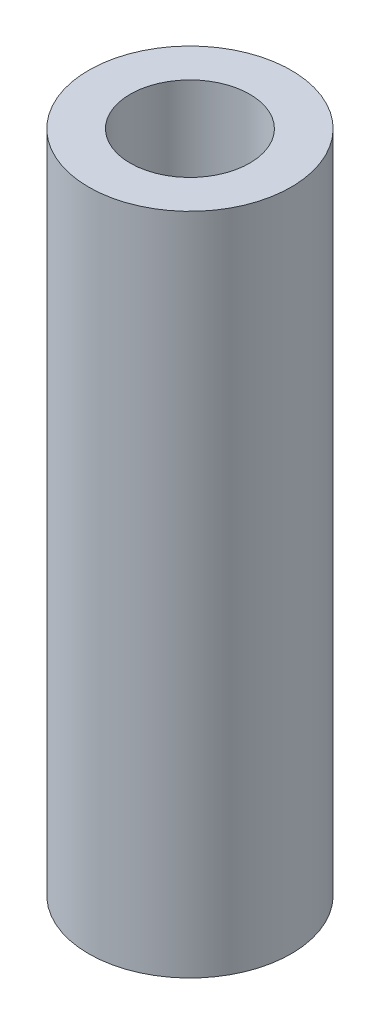
ISO-10303-21;
HEADER;
FILE_DESCRIPTION(('STEP AP214'),'2;1');
FILE_NAME('part.step','',(''),(''),'','','');
FILE_SCHEMA(('AUTOMOTIVE_DESIGN { 1 0 10303 214 1 1 1 1 }'));
ENDSEC;
DATA;
#1=APPLICATION_CONTEXT('core data for automotive mechanical design processes');
#2=APPLICATION_PROTOCOL_DEFINITION('international standard','automotive_design',2000,#1);
#3=PRODUCT_CONTEXT('',#1,'mechanical');
#4=PRODUCT('Part','Part','',(#3));
#5=PRODUCT_RELATED_PRODUCT_CATEGORY('part','',(#4));
#6=PRODUCT_DEFINITION_FORMATION('','',#4);
#7=PRODUCT_DEFINITION_CONTEXT('part definition',#1,'design');
#8=PRODUCT_DEFINITION('design','',#6,#7);
#9=PRODUCT_DEFINITION_SHAPE('','',#8);
#10=(LENGTH_UNIT() NAMED_UNIT(*) SI_UNIT(.MILLI.,.METRE.));
#11=(NAMED_UNIT(*) PLANE_ANGLE_UNIT() SI_UNIT($,.RADIAN.));
#12=(NAMED_UNIT(*) SI_UNIT($,.STERADIAN.) SOLID_ANGLE_UNIT());
#13=UNCERTAINTY_MEASURE_WITH_UNIT(LENGTH_MEASURE(1.E-05),#10,'distance_accuracy_value','');
#14=(GEOMETRIC_REPRESENTATION_CONTEXT(3) GLOBAL_UNCERTAINTY_ASSIGNED_CONTEXT((#13)) GLOBAL_UNIT_ASSIGNED_CONTEXT((#10,
#11,#12)) REPRESENTATION_CONTEXT('',''));
#15=CARTESIAN_POINT('',(0.,0.,0.));
#16=DIRECTION('',(0.,0.,1.));
#17=DIRECTION('',(1.,0.,0.));
#18=AXIS2_PLACEMENT_3D('',#15,#16,#17);
#19=CARTESIAN_POINT('',(0.,10.,0.));
#20=DIRECTION('',(0.,1.,0.));
#21=DIRECTION('',(0.,0.,1.));
#22=AXIS2_PLACEMENT_3D('',#19,#20,#21);
#23=PLANE('',#22);
#24=CARTESIAN_POINT('',(0.,10.,0.));
#25=DIRECTION('',(0.,1.,0.));
#26=DIRECTION('',(0.,0.,1.));
#27=AXIS2_PLACEMENT_3D('',#24,#25,#26);
#28=CIRCLE('',#27,1.525);
#29=CARTESIAN_POINT('',(0.,10.,1.525));
#30=VERTEX_POINT('',#29);
#31=EDGE_CURVE('E10',#30,#30,#28,.T.);
#32=ORIENTED_EDGE('',*,*,#31,.T.);
#33=EDGE_LOOP('',(#32));
#34=FACE_BOUND('',#33,.T.);
#35=CARTESIAN_POINT('',(0.,10.,0.));
#36=DIRECTION('',(0.,1.,0.));
#37=DIRECTION('',(0.,0.,1.));
#38=AXIS2_PLACEMENT_3D('',#35,#36,#37);
#39=CIRCLE('',#38,0.9);
#40=CARTESIAN_POINT('',(0.,10.,0.9));
#41=VERTEX_POINT('',#40);
#42=EDGE_CURVE('E41',#41,#41,#39,.T.);
#43=ORIENTED_EDGE('',*,*,#42,.F.);
#44=EDGE_LOOP('',(#43));
#45=FACE_BOUND('',#44,.T.);
#46=ADVANCED_FACE('F30',(#34,#45),#23,.T.);
#47=CARTESIAN_POINT('',(0.,0.,0.));
#48=DIRECTION('',(0.,1.,0.));
#49=DIRECTION('',(0.,0.,1.));
#50=AXIS2_PLACEMENT_3D('',#47,#48,#49);
#51=PLANE('',#50);
#52=CARTESIAN_POINT('',(0.,0.,0.));
#53=DIRECTION('',(0.,1.,0.));
#54=DIRECTION('',(0.,0.,1.));
#55=AXIS2_PLACEMENT_3D('',#52,#53,#54);
#56=CIRCLE('',#55,1.525);
#57=CARTESIAN_POINT('',(0.,0.,1.525));
#58=VERTEX_POINT('',#57);
#59=EDGE_CURVE('E34',#58,#58,#56,.T.);
#60=ORIENTED_EDGE('',*,*,#59,.F.);
#61=EDGE_LOOP('',(#60));
#62=FACE_BOUND('',#61,.T.);
#63=CARTESIAN_POINT('',(0.,0.,0.));
#64=DIRECTION('',(0.,1.,0.));
#65=DIRECTION('',(0.,0.,1.));
#66=AXIS2_PLACEMENT_3D('',#63,#64,#65);
#67=CIRCLE('',#66,0.9);
#68=CARTESIAN_POINT('',(0.,0.,0.9));
#69=VERTEX_POINT('',#68);
#70=EDGE_CURVE('E43',#69,#69,#67,.T.);
#71=ORIENTED_EDGE('',*,*,#70,.T.);
#72=EDGE_LOOP('',(#71));
#73=FACE_BOUND('',#72,.T.);
#74=ADVANCED_FACE('F53',(#62,#73),#51,.F.);
#75=CARTESIAN_POINT('',(0.,10.,0.));
#76=DIRECTION('',(0.,-1.,0.));
#77=DIRECTION('',(0.,0.,-1.));
#78=AXIS2_PLACEMENT_3D('',#75,#76,#77);
#79=CYLINDRICAL_SURFACE('',#78,1.525);
#80=ORIENTED_EDGE('',*,*,#31,.F.);
#81=EDGE_LOOP('',(#80));
#82=FACE_BOUND('',#81,.T.);
#83=ORIENTED_EDGE('',*,*,#59,.T.);
#84=EDGE_LOOP('',(#83));
#85=FACE_BOUND('',#84,.T.);
#86=ADVANCED_FACE('F32',(#82,#85),#79,.T.);
#87=CARTESIAN_POINT('',(0.,10.,0.));
#88=DIRECTION('',(0.,-1.,0.));
#89=DIRECTION('',(0.,0.,-1.));
#90=AXIS2_PLACEMENT_3D('',#87,#88,#89);
#91=CYLINDRICAL_SURFACE('',#90,0.9);
#92=ORIENTED_EDGE('',*,*,#42,.T.);
#93=EDGE_LOOP('',(#92));
#94=FACE_BOUND('',#93,.T.);
#95=ORIENTED_EDGE('',*,*,#70,.F.);
#96=EDGE_LOOP('',(#95));
#97=FACE_BOUND('',#96,.T.);
#98=ADVANCED_FACE('F49',(#94,#97),#91,.F.);
#99=CLOSED_SHELL('',(#46,#74,#86,#98));
#100=MANIFOLD_SOLID_BREP('B2',#99);
#101=ADVANCED_BREP_SHAPE_REPRESENTATION('',(#18,#100),#14);
#102=SHAPE_DEFINITION_REPRESENTATION(#9,#101);
ENDSEC;
END-ISO-10303-21;
